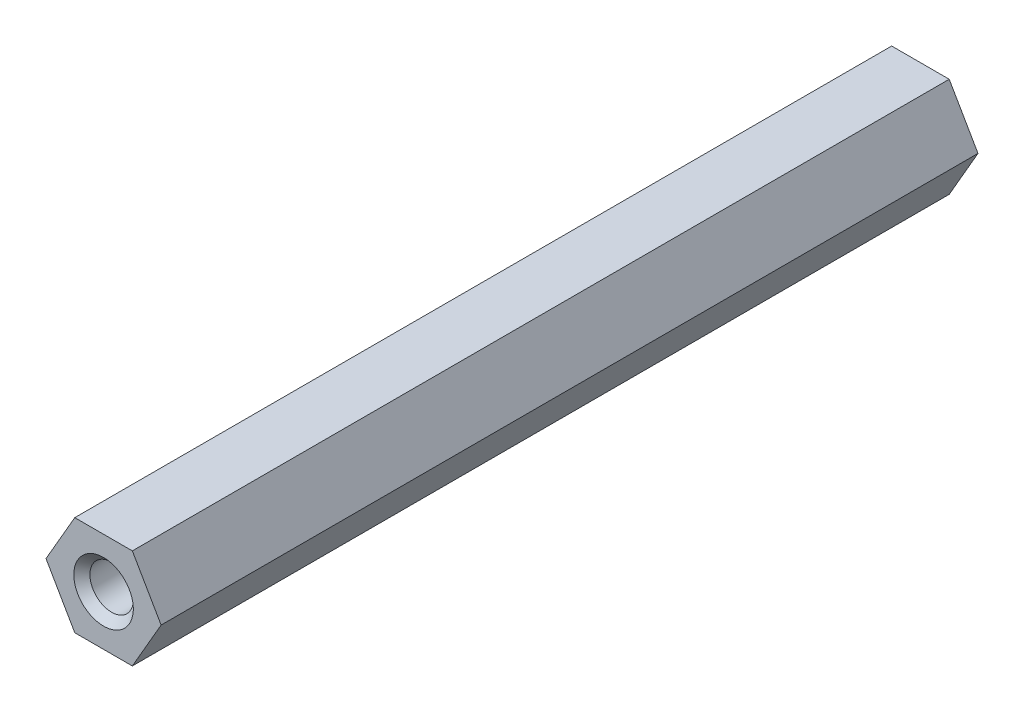
ISO-10303-21;
HEADER;
FILE_DESCRIPTION(('STEP AP214'),'2;1');
FILE_NAME('part.step','',(''),(''),'','','');
FILE_SCHEMA(('AUTOMOTIVE_DESIGN { 1 0 10303 214 1 1 1 1 }'));
ENDSEC;
DATA;
#1=APPLICATION_CONTEXT('core data for automotive mechanical design processes');
#2=APPLICATION_PROTOCOL_DEFINITION('international standard','automotive_design',2000,#1);
#3=PRODUCT_CONTEXT('',#1,'mechanical');
#4=PRODUCT('Part','Part','',(#3));
#5=PRODUCT_RELATED_PRODUCT_CATEGORY('part','',(#4));
#6=PRODUCT_DEFINITION_FORMATION('','',#4);
#7=PRODUCT_DEFINITION_CONTEXT('part definition',#1,'design');
#8=PRODUCT_DEFINITION('design','',#6,#7);
#9=PRODUCT_DEFINITION_SHAPE('','',#8);
#10=(LENGTH_UNIT() NAMED_UNIT(*) SI_UNIT(.MILLI.,.METRE.));
#11=(NAMED_UNIT(*) PLANE_ANGLE_UNIT() SI_UNIT($,.RADIAN.));
#12=(NAMED_UNIT(*) SI_UNIT($,.STERADIAN.) SOLID_ANGLE_UNIT());
#13=UNCERTAINTY_MEASURE_WITH_UNIT(LENGTH_MEASURE(1.E-05),#10,'distance_accuracy_value','');
#14=(GEOMETRIC_REPRESENTATION_CONTEXT(3) GLOBAL_UNCERTAINTY_ASSIGNED_CONTEXT((#13)) GLOBAL_UNIT_ASSIGNED_CONTEXT((#10,
#11,#12)) REPRESENTATION_CONTEXT('',''));
#15=CARTESIAN_POINT('',(0.,0.,0.));
#16=DIRECTION('',(0.,0.,1.));
#17=DIRECTION('',(1.,0.,0.));
#18=AXIS2_PLACEMENT_3D('',#15,#16,#17);
#19=CARTESIAN_POINT('',(0.165236746964321,-17.9840979144325,-14.4307111345464));
#20=DIRECTION('',(0.866025403784439,-0.5,0.));
#21=DIRECTION('',(0.5,0.866025403784439,0.));
#22=AXIS2_PLACEMENT_3D('',#19,#20,#21);
#23=PLANE('',#22);
#24=DIRECTION('',(0.5,0.866025403784439,0.));
#25=VECTOR('',#24,1.);
#26=CARTESIAN_POINT('',(0.165236746964321,-17.9840979144325,36.3692888654536));
#27=LINE('',#26,#25);
#28=CARTESIAN_POINT('',(0.165236746964321,-17.9840979144325,36.3692888654536));
#29=VERTEX_POINT('',#28);
#30=CARTESIAN_POINT('',(1.95502258145216,-14.8840979144325,36.3692888654536));
#31=VERTEX_POINT('',#30);
#32=EDGE_CURVE('E103',#29,#31,#27,.T.);
#33=ORIENTED_EDGE('',*,*,#32,.F.);
#34=DIRECTION('',(0.,0.,1.));
#35=VECTOR('',#34,1.);
#36=CARTESIAN_POINT('',(0.165236746964321,-17.9840979144325,-14.4307111345464));
#37=LINE('',#36,#35);
#38=CARTESIAN_POINT('',(0.165236746964321,-17.9840979144325,-14.4307111345464));
#39=VERTEX_POINT('',#38);
#40=EDGE_CURVE('E32',#39,#29,#37,.T.);
#41=ORIENTED_EDGE('',*,*,#40,.F.);
#42=DIRECTION('',(0.5,0.866025403784439,0.));
#43=VECTOR('',#42,1.);
#44=CARTESIAN_POINT('',(0.165236746964321,-17.9840979144325,-14.4307111345464));
#45=LINE('',#44,#43);
#46=CARTESIAN_POINT('',(1.95502258145216,-14.8840979144325,-14.4307111345464));
#47=VERTEX_POINT('',#46);
#48=EDGE_CURVE('E118',#39,#47,#45,.T.);
#49=ORIENTED_EDGE('',*,*,#48,.T.);
#50=DIRECTION('',(0.,0.,1.));
#51=VECTOR('',#50,1.);
#52=CARTESIAN_POINT('',(1.95502258145216,-14.8840979144325,-14.4307111345464));
#53=LINE('',#52,#51);
#54=EDGE_CURVE('E67',#47,#31,#53,.T.);
#55=ORIENTED_EDGE('',*,*,#54,.T.);
#56=EDGE_LOOP('',(#33,#41,#49,#55));
#57=FACE_BOUND('',#56,.T.);
#58=ADVANCED_FACE('F15',(#57),#23,.T.);
#59=CARTESIAN_POINT('',(-3.41433492201136,-17.9840979144325,-14.4307111345464));
#60=DIRECTION('',(0.,-1.,0.));
#61=DIRECTION('',(0.,0.,-1.));
#62=AXIS2_PLACEMENT_3D('',#59,#60,#61);
#63=PLANE('',#62);
#64=DIRECTION('',(1.,0.,0.));
#65=VECTOR('',#64,1.);
#66=CARTESIAN_POINT('',(-3.41433492201136,-17.9840979144325,36.3692888654536));
#67=LINE('',#66,#65);
#68=CARTESIAN_POINT('',(-3.41433492201136,-17.9840979144325,36.3692888654536));
#69=VERTEX_POINT('',#68);
#70=EDGE_CURVE('E115',#69,#29,#67,.T.);
#71=ORIENTED_EDGE('',*,*,#70,.F.);
#72=DIRECTION('',(0.,0.,1.));
#73=VECTOR('',#72,1.);
#74=CARTESIAN_POINT('',(-3.41433492201136,-17.9840979144325,-14.4307111345464));
#75=LINE('',#74,#73);
#76=CARTESIAN_POINT('',(-3.41433492201136,-17.9840979144325,-14.4307111345464));
#77=VERTEX_POINT('',#76);
#78=EDGE_CURVE('E55',#77,#69,#75,.T.);
#79=ORIENTED_EDGE('',*,*,#78,.F.);
#80=DIRECTION('',(1.,0.,0.));
#81=VECTOR('',#80,1.);
#82=CARTESIAN_POINT('',(-3.41433492201136,-17.9840979144325,-14.4307111345464));
#83=LINE('',#82,#81);
#84=EDGE_CURVE('E93',#77,#39,#83,.T.);
#85=ORIENTED_EDGE('',*,*,#84,.T.);
#86=ORIENTED_EDGE('',*,*,#40,.T.);
#87=EDGE_LOOP('',(#71,#79,#85,#86));
#88=FACE_BOUND('',#87,.T.);
#89=ADVANCED_FACE('F156',(#88),#63,.T.);
#90=CARTESIAN_POINT('',(-5.2041207564992,-14.8840979144325,-14.4307111345464));
#91=DIRECTION('',(-0.866025403784438,-0.5,0.));
#92=DIRECTION('',(0.5,-0.866025403784439,0.));
#93=AXIS2_PLACEMENT_3D('',#90,#91,#92);
#94=PLANE('',#93);
#95=DIRECTION('',(0.5,-0.866025403784438,0.));
#96=VECTOR('',#95,1.);
#97=CARTESIAN_POINT('',(-5.2041207564992,-14.8840979144325,36.3692888654536));
#98=LINE('',#97,#96);
#99=CARTESIAN_POINT('',(-5.2041207564992,-14.8840979144325,36.3692888654536));
#100=VERTEX_POINT('',#99);
#101=EDGE_CURVE('E80',#100,#69,#98,.T.);
#102=ORIENTED_EDGE('',*,*,#101,.F.);
#103=DIRECTION('',(0.,0.,1.));
#104=VECTOR('',#103,1.);
#105=CARTESIAN_POINT('',(-5.2041207564992,-14.8840979144325,-14.4307111345464));
#106=LINE('',#105,#104);
#107=CARTESIAN_POINT('',(-5.2041207564992,-14.8840979144325,-14.4307111345464));
#108=VERTEX_POINT('',#107);
#109=EDGE_CURVE('E75',#108,#100,#106,.T.);
#110=ORIENTED_EDGE('',*,*,#109,.F.);
#111=DIRECTION('',(0.5,-0.866025403784438,0.));
#112=VECTOR('',#111,1.);
#113=CARTESIAN_POINT('',(-5.2041207564992,-14.8840979144325,-14.4307111345464));
#114=LINE('',#113,#112);
#115=EDGE_CURVE('E78',#108,#77,#114,.T.);
#116=ORIENTED_EDGE('',*,*,#115,.T.);
#117=ORIENTED_EDGE('',*,*,#78,.T.);
#118=EDGE_LOOP('',(#102,#110,#116,#117));
#119=FACE_BOUND('',#118,.T.);
#120=ADVANCED_FACE('F77',(#119),#94,.T.);
#121=CARTESIAN_POINT('',(-3.41433492201136,-11.7840979144325,-14.4307111345464));
#122=DIRECTION('',(-0.866025403784439,0.5,0.));
#123=DIRECTION('',(-0.5,-0.866025403784439,0.));
#124=AXIS2_PLACEMENT_3D('',#121,#122,#123);
#125=PLANE('',#124);
#126=DIRECTION('',(-0.5,-0.866025403784439,0.));
#127=VECTOR('',#126,1.);
#128=CARTESIAN_POINT('',(-3.41433492201136,-11.7840979144325,36.3692888654536));
#129=LINE('',#128,#127);
#130=CARTESIAN_POINT('',(-3.41433492201136,-11.7840979144325,36.3692888654536));
#131=VERTEX_POINT('',#130);
#132=EDGE_CURVE('E112',#131,#100,#129,.T.);
#133=ORIENTED_EDGE('',*,*,#132,.F.);
#134=DIRECTION('',(0.,0.,1.));
#135=VECTOR('',#134,1.);
#136=CARTESIAN_POINT('',(-3.41433492201136,-11.7840979144325,-14.4307111345464));
#137=LINE('',#136,#135);
#138=CARTESIAN_POINT('',(-3.41433492201136,-11.7840979144325,-14.4307111345464));
#139=VERTEX_POINT('',#138);
#140=EDGE_CURVE('E85',#139,#131,#137,.T.);
#141=ORIENTED_EDGE('',*,*,#140,.F.);
#142=DIRECTION('',(-0.5,-0.866025403784439,0.));
#143=VECTOR('',#142,1.);
#144=CARTESIAN_POINT('',(-3.41433492201136,-11.7840979144325,-14.4307111345464));
#145=LINE('',#144,#143);
#146=EDGE_CURVE('E91',#139,#108,#145,.T.);
#147=ORIENTED_EDGE('',*,*,#146,.T.);
#148=ORIENTED_EDGE('',*,*,#109,.T.);
#149=EDGE_LOOP('',(#133,#141,#147,#148));
#150=FACE_BOUND('',#149,.T.);
#151=ADVANCED_FACE('F95',(#150),#125,.T.);
#152=CARTESIAN_POINT('',(0.165236746964322,-11.7840979144325,-14.4307111345464));
#153=DIRECTION('',(0.,1.,0.));
#154=DIRECTION('',(-1.,0.,0.));
#155=AXIS2_PLACEMENT_3D('',#152,#153,#154);
#156=PLANE('',#155);
#157=DIRECTION('',(-1.,0.,0.));
#158=VECTOR('',#157,1.);
#159=CARTESIAN_POINT('',(0.165236746964322,-11.7840979144325,36.3692888654536));
#160=LINE('',#159,#158);
#161=CARTESIAN_POINT('',(0.165236746964322,-11.7840979144325,36.3692888654536));
#162=VERTEX_POINT('',#161);
#163=EDGE_CURVE('E109',#162,#131,#160,.T.);
#164=ORIENTED_EDGE('',*,*,#163,.F.);
#165=DIRECTION('',(0.,0.,1.));
#166=VECTOR('',#165,1.);
#167=CARTESIAN_POINT('',(0.165236746964322,-11.7840979144325,-14.4307111345464));
#168=LINE('',#167,#166);
#169=CARTESIAN_POINT('',(0.165236746964322,-11.7840979144325,-14.4307111345464));
#170=VERTEX_POINT('',#169);
#171=EDGE_CURVE('E123',#170,#162,#168,.T.);
#172=ORIENTED_EDGE('',*,*,#171,.F.);
#173=DIRECTION('',(-1.,0.,0.));
#174=VECTOR('',#173,1.);
#175=CARTESIAN_POINT('',(0.165236746964322,-11.7840979144325,-14.4307111345464));
#176=LINE('',#175,#174);
#177=EDGE_CURVE('E96',#170,#139,#176,.T.);
#178=ORIENTED_EDGE('',*,*,#177,.T.);
#179=ORIENTED_EDGE('',*,*,#140,.T.);
#180=EDGE_LOOP('',(#164,#172,#178,#179));
#181=FACE_BOUND('',#180,.T.);
#182=ADVANCED_FACE('F152',(#181),#156,.T.);
#183=CARTESIAN_POINT('',(1.95502258145216,-14.8840979144325,-14.4307111345464));
#184=DIRECTION('',(0.866025403784439,0.5,0.));
#185=DIRECTION('',(-0.5,0.866025403784439,0.));
#186=AXIS2_PLACEMENT_3D('',#183,#184,#185);
#187=PLANE('',#186);
#188=DIRECTION('',(-0.5,0.866025403784439,0.));
#189=VECTOR('',#188,1.);
#190=CARTESIAN_POINT('',(1.95502258145216,-14.8840979144325,36.3692888654536));
#191=LINE('',#190,#189);
#192=EDGE_CURVE('E106',#31,#162,#191,.T.);
#193=ORIENTED_EDGE('',*,*,#192,.F.);
#194=ORIENTED_EDGE('',*,*,#54,.F.);
#195=DIRECTION('',(-0.5,0.866025403784439,0.));
#196=VECTOR('',#195,1.);
#197=CARTESIAN_POINT('',(1.95502258145216,-14.8840979144325,-14.4307111345464));
#198=LINE('',#197,#196);
#199=EDGE_CURVE('E98',#47,#170,#198,.T.);
#200=ORIENTED_EDGE('',*,*,#199,.T.);
#201=ORIENTED_EDGE('',*,*,#171,.T.);
#202=EDGE_LOOP('',(#193,#194,#200,#201));
#203=FACE_BOUND('',#202,.T.);
#204=ADVANCED_FACE('F143',(#203),#187,.T.);
#205=CARTESIAN_POINT('',(-1.62454908752352,-21.0840979144325,-14.4307111345464));
#206=DIRECTION('',(0.,0.,-1.));
#207=DIRECTION('',(-1.,0.,0.));
#208=AXIS2_PLACEMENT_3D('',#205,#206,#207);
#209=PLANE('',#208);
#210=CARTESIAN_POINT('',(-1.62454908752352,-14.8840979144325,-14.4307111345464));
#211=DIRECTION('',(0.,0.,-1.));
#212=DIRECTION('',(-1.,0.,0.));
#213=AXIS2_PLACEMENT_3D('',#210,#211,#212);
#214=CIRCLE('',#213,1.85);
#215=CARTESIAN_POINT('',(-3.47454908752352,-14.8840979144325,-14.4307111345464));
#216=VERTEX_POINT('',#215);
#217=EDGE_CURVE('E120',#216,#216,#214,.F.);
#218=ORIENTED_EDGE('',*,*,#217,.T.);
#219=EDGE_LOOP('',(#218));
#220=FACE_BOUND('',#219,.T.);
#221=ORIENTED_EDGE('',*,*,#48,.F.);
#222=ORIENTED_EDGE('',*,*,#84,.F.);
#223=ORIENTED_EDGE('',*,*,#115,.F.);
#224=ORIENTED_EDGE('',*,*,#146,.F.);
#225=ORIENTED_EDGE('',*,*,#177,.F.);
#226=ORIENTED_EDGE('',*,*,#199,.F.);
#227=EDGE_LOOP('',(#221,#222,#223,#224,#225,#226));
#228=FACE_BOUND('',#227,.T.);
#229=ADVANCED_FACE('F89',(#220,#228),#209,.T.);
#230=CARTESIAN_POINT('',(-1.62454908752352,-21.0840979144325,36.3692888654536));
#231=DIRECTION('',(0.,0.,-1.));
#232=DIRECTION('',(-1.,0.,0.));
#233=AXIS2_PLACEMENT_3D('',#230,#231,#232);
#234=PLANE('',#233);
#235=CARTESIAN_POINT('',(-1.62454908752352,-14.8840979144325,36.3692888654536));
#236=DIRECTION('',(0.,0.,-1.));
#237=DIRECTION('',(-1.,0.,0.));
#238=AXIS2_PLACEMENT_3D('',#235,#236,#237);
#239=CIRCLE('',#238,1.85);
#240=CARTESIAN_POINT('',(-3.47454908752352,-14.8840979144325,36.3692888654536));
#241=VERTEX_POINT('',#240);
#242=EDGE_CURVE('E9',#241,#241,#239,.T.);
#243=ORIENTED_EDGE('',*,*,#242,.T.);
#244=EDGE_LOOP('',(#243));
#245=FACE_BOUND('',#244,.T.);
#246=ORIENTED_EDGE('',*,*,#32,.T.);
#247=ORIENTED_EDGE('',*,*,#192,.T.);
#248=ORIENTED_EDGE('',*,*,#163,.T.);
#249=ORIENTED_EDGE('',*,*,#132,.T.);
#250=ORIENTED_EDGE('',*,*,#101,.T.);
#251=ORIENTED_EDGE('',*,*,#70,.T.);
#252=EDGE_LOOP('',(#246,#247,#248,#249,#250,#251));
#253=FACE_BOUND('',#252,.T.);
#254=ADVANCED_FACE('F142',(#245,#253),#234,.F.);
#255=CARTESIAN_POINT('',(-1.62454908752352,-14.8840979144325,-14.4307111345464));
#256=DIRECTION('',(0.,0.,1.));
#257=DIRECTION('',(1.,0.,0.));
#258=AXIS2_PLACEMENT_3D('',#255,#256,#257);
#259=CYLINDRICAL_SURFACE('',#258,1.35);
#260=CARTESIAN_POINT('',(-1.62454908752352,-14.8840979144325,-13.9307111345464));
#261=DIRECTION('',(0.,0.,-1.));
#262=DIRECTION('',(-1.,0.,0.));
#263=AXIS2_PLACEMENT_3D('',#260,#261,#262);
#264=CIRCLE('',#263,1.35);
#265=CARTESIAN_POINT('',(-2.97454908752352,-14.8840979144325,-13.9307111345464));
#266=VERTEX_POINT('',#265);
#267=EDGE_CURVE('E24',#266,#266,#264,.T.);
#268=ORIENTED_EDGE('',*,*,#267,.T.);
#269=EDGE_LOOP('',(#268));
#270=FACE_BOUND('',#269,.T.);
#271=CARTESIAN_POINT('',(-1.62454908752352,-14.8840979144325,35.8692888654536));
#272=DIRECTION('',(0.,0.,-1.));
#273=DIRECTION('',(-1.,0.,0.));
#274=AXIS2_PLACEMENT_3D('',#271,#272,#273);
#275=CIRCLE('',#274,1.35);
#276=CARTESIAN_POINT('',(-2.97454908752352,-14.8840979144325,35.8692888654536));
#277=VERTEX_POINT('',#276);
#278=EDGE_CURVE('E128',#277,#277,#275,.F.);
#279=ORIENTED_EDGE('',*,*,#278,.T.);
#280=EDGE_LOOP('',(#279));
#281=FACE_BOUND('',#280,.T.);
#282=ADVANCED_FACE('F133',(#270,#281),#259,.F.);
#283=CARTESIAN_POINT('',(-1.62454908752352,-14.8840979144325,-14.4307111345464));
#284=DIRECTION('',(0.,0.,-1.));
#285=DIRECTION('',(-1.,0.,0.));
#286=AXIS2_PLACEMENT_3D('',#283,#284,#285);
#287=CONICAL_SURFACE('',#286,1.85,0.785398163397445);
#288=ORIENTED_EDGE('',*,*,#267,.F.);
#289=EDGE_LOOP('',(#288));
#290=FACE_BOUND('',#289,.T.);
#291=ORIENTED_EDGE('',*,*,#217,.F.);
#292=EDGE_LOOP('',(#291));
#293=FACE_BOUND('',#292,.T.);
#294=ADVANCED_FACE('F136',(#290,#293),#287,.F.);
#295=CARTESIAN_POINT('',(-1.62454908752352,-14.8840979144325,35.8692888654536));
#296=DIRECTION('',(0.,0.,1.));
#297=DIRECTION('',(1.,0.,0.));
#298=AXIS2_PLACEMENT_3D('',#295,#296,#297);
#299=CONICAL_SURFACE('',#298,1.35,0.785398163397452);
#300=ORIENTED_EDGE('',*,*,#242,.F.);
#301=EDGE_LOOP('',(#300));
#302=FACE_BOUND('',#301,.T.);
#303=ORIENTED_EDGE('',*,*,#278,.F.);
#304=EDGE_LOOP('',(#303));
#305=FACE_BOUND('',#304,.T.);
#306=ADVANCED_FACE('F17',(#302,#305),#299,.F.);
#307=CLOSED_SHELL('',(#58,#89,#120,#151,#182,#204,#229,#254,#282,#294,#306));
#308=MANIFOLD_SOLID_BREP('B1',#307);
#309=ADVANCED_BREP_SHAPE_REPRESENTATION('',(#18,#308),#14);
#310=SHAPE_DEFINITION_REPRESENTATION(#9,#309);
ENDSEC;
END-ISO-10303-21;
